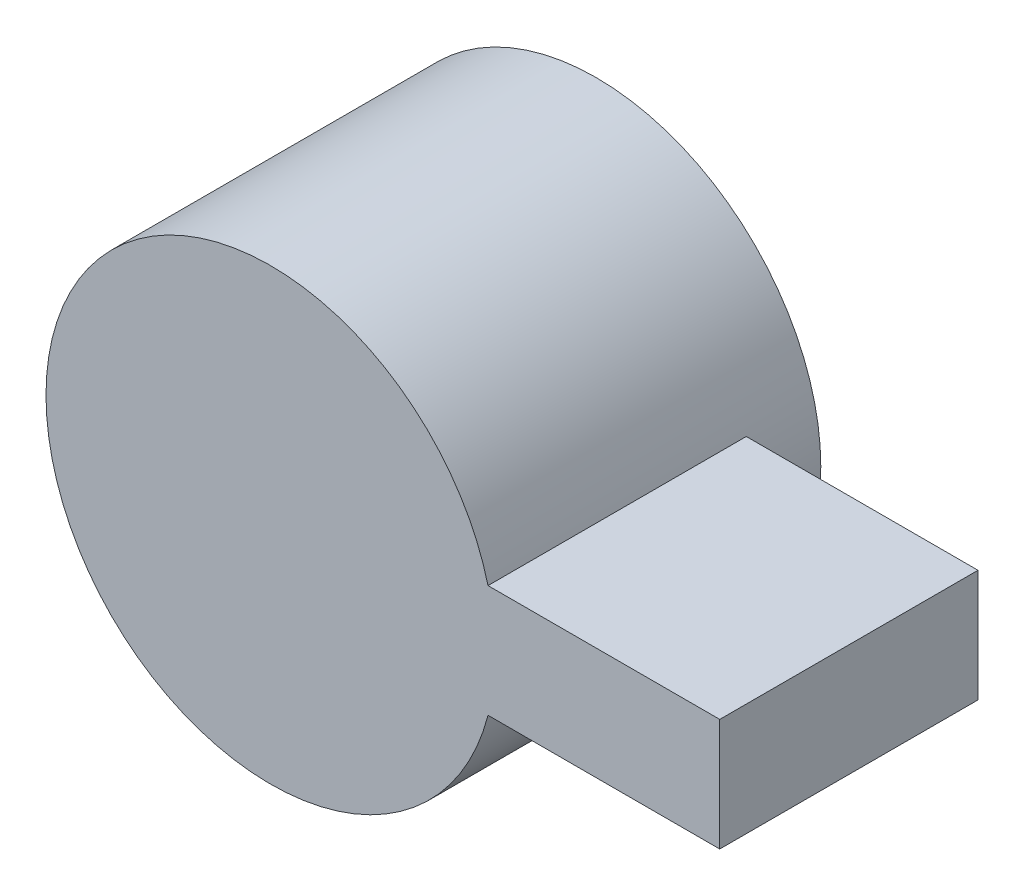
ISO-10303-21;
HEADER;
FILE_DESCRIPTION(('STEP AP214'),'2;1');
FILE_NAME('part.step','',(''),(''),'','','');
FILE_SCHEMA(('AUTOMOTIVE_DESIGN { 1 0 10303 214 1 1 1 1 }'));
ENDSEC;
DATA;
#1=APPLICATION_CONTEXT('core data for automotive mechanical design processes');
#2=APPLICATION_PROTOCOL_DEFINITION('international standard','automotive_design',2000,#1);
#3=PRODUCT_CONTEXT('',#1,'mechanical');
#4=PRODUCT('Part','Part','',(#3));
#5=PRODUCT_RELATED_PRODUCT_CATEGORY('part','',(#4));
#6=PRODUCT_DEFINITION_FORMATION('','',#4);
#7=PRODUCT_DEFINITION_CONTEXT('part definition',#1,'design');
#8=PRODUCT_DEFINITION('design','',#6,#7);
#9=PRODUCT_DEFINITION_SHAPE('','',#8);
#10=(LENGTH_UNIT() NAMED_UNIT(*) SI_UNIT(.MILLI.,.METRE.));
#11=(NAMED_UNIT(*) PLANE_ANGLE_UNIT() SI_UNIT($,.RADIAN.));
#12=(NAMED_UNIT(*) SI_UNIT($,.STERADIAN.) SOLID_ANGLE_UNIT());
#13=UNCERTAINTY_MEASURE_WITH_UNIT(LENGTH_MEASURE(1.E-05),#10,'distance_accuracy_value','');
#14=(GEOMETRIC_REPRESENTATION_CONTEXT(3) GLOBAL_UNCERTAINTY_ASSIGNED_CONTEXT((#13)) GLOBAL_UNIT_ASSIGNED_CONTEXT((#10,
#11,#12)) REPRESENTATION_CONTEXT('',''));
#15=CARTESIAN_POINT('',(0.,0.,0.));
#16=DIRECTION('',(0.,0.,1.));
#17=DIRECTION('',(1.,0.,0.));
#18=AXIS2_PLACEMENT_3D('',#15,#16,#17);
#19=CARTESIAN_POINT('',(0.,0.,0.));
#20=DIRECTION('',(0.,0.,1.));
#21=DIRECTION('',(1.,0.,0.));
#22=AXIS2_PLACEMENT_3D('',#19,#20,#21);
#23=PLANE('',#22);
#24=DIRECTION('',(0.,-1.,0.));
#25=VECTOR('',#24,1.);
#26=CARTESIAN_POINT('',(1.55,0.,0.));
#27=LINE('',#26,#25);
#28=CARTESIAN_POINT('',(1.55,2.62678510731274,0.));
#29=VERTEX_POINT('',#28);
#30=CARTESIAN_POINT('',(1.55,-2.62678510731274,0.));
#31=VERTEX_POINT('',#30);
#32=EDGE_CURVE('E102',#29,#31,#27,.T.);
#33=ORIENTED_EDGE('',*,*,#32,.F.);
#34=CARTESIAN_POINT('',(0.,0.,0.));
#35=DIRECTION('',(0.,0.,-1.));
#36=DIRECTION('',(-1.,0.,0.));
#37=AXIS2_PLACEMENT_3D('',#34,#35,#36);
#38=CIRCLE('',#37,3.05);
#39=EDGE_CURVE('E117',#29,#31,#38,.T.);
#40=ORIENTED_EDGE('',*,*,#39,.T.);
#41=EDGE_LOOP('',(#33,#40));
#42=FACE_BOUND('',#41,.T.);
#43=ADVANCED_FACE('F45',(#42),#23,.F.);
#44=CARTESIAN_POINT('',(0.,0.,10.));
#45=DIRECTION('',(0.,0.,-1.));
#46=DIRECTION('',(-1.,0.,0.));
#47=AXIS2_PLACEMENT_3D('',#44,#45,#46);
#48=CYLINDRICAL_SURFACE('',#47,3.05);
#49=DIRECTION('',(0.,0.,-1.));
#50=VECTOR('',#49,1.);
#51=CARTESIAN_POINT('',(1.55,-2.62678510731274,10.));
#52=LINE('',#51,#50);
#53=CARTESIAN_POINT('',(1.55,-2.62678510731274,10.));
#54=VERTEX_POINT('',#53);
#55=EDGE_CURVE('E105',#54,#31,#52,.T.);
#56=ORIENTED_EDGE('',*,*,#55,.T.);
#57=ORIENTED_EDGE('',*,*,#39,.F.);
#58=DIRECTION('',(0.,0.,-1.));
#59=VECTOR('',#58,1.);
#60=CARTESIAN_POINT('',(1.55,2.62678510731274,10.));
#61=LINE('',#60,#59);
#62=CARTESIAN_POINT('',(1.55,2.62678510731274,10.));
#63=VERTEX_POINT('',#62);
#64=EDGE_CURVE('E61',#63,#29,#61,.T.);
#65=ORIENTED_EDGE('',*,*,#64,.F.);
#66=CARTESIAN_POINT('',(0.,0.,10.));
#67=DIRECTION('',(0.,0.,1.));
#68=DIRECTION('',(1.,0.,0.));
#69=AXIS2_PLACEMENT_3D('',#66,#67,#68);
#70=CIRCLE('',#69,3.05);
#71=EDGE_CURVE('E111',#63,#54,#70,.T.);
#72=ORIENTED_EDGE('',*,*,#71,.T.);
#73=EDGE_LOOP('',(#56,#57,#65,#72));
#74=FACE_BOUND('',#73,.T.);
#75=CARTESIAN_POINT('',(0.,0.,-3.));
#76=DIRECTION('',(0.,0.,-1.));
#77=DIRECTION('',(-1.,0.,0.));
#78=AXIS2_PLACEMENT_3D('',#75,#76,#77);
#79=CIRCLE('',#78,3.05);
#80=CARTESIAN_POINT('',(-3.05,0.,-3.));
#81=VERTEX_POINT('',#80);
#82=EDGE_CURVE('E126',#81,#81,#79,.T.);
#83=ORIENTED_EDGE('',*,*,#82,.T.);
#84=EDGE_LOOP('',(#83));
#85=FACE_BOUND('',#84,.T.);
#86=ADVANCED_FACE('F115',(#74,#85),#48,.F.);
#87=CARTESIAN_POINT('',(1.55,0.,10.));
#88=DIRECTION('',(1.,0.,0.));
#89=DIRECTION('',(0.,0.,-1.));
#90=AXIS2_PLACEMENT_3D('',#87,#88,#89);
#91=PLANE('',#90);
#92=ORIENTED_EDGE('',*,*,#32,.T.);
#93=ORIENTED_EDGE('',*,*,#55,.F.);
#94=DIRECTION('',(0.,-1.,0.));
#95=VECTOR('',#94,1.);
#96=CARTESIAN_POINT('',(1.55,0.,10.));
#97=LINE('',#96,#95);
#98=EDGE_CURVE('E133',#63,#54,#97,.T.);
#99=ORIENTED_EDGE('',*,*,#98,.F.);
#100=ORIENTED_EDGE('',*,*,#64,.T.);
#101=EDGE_LOOP('',(#92,#93,#99,#100));
#102=FACE_BOUND('',#101,.T.);
#103=ADVANCED_FACE('F104',(#102),#91,.F.);
#104=CARTESIAN_POINT('',(0.,0.,10.));
#105=DIRECTION('',(0.,0.,1.));
#106=DIRECTION('',(1.,0.,0.));
#107=AXIS2_PLACEMENT_3D('',#104,#105,#106);
#108=PLANE('',#107);
#109=ORIENTED_EDGE('',*,*,#71,.F.);
#110=ORIENTED_EDGE('',*,*,#98,.T.);
#111=EDGE_LOOP('',(#109,#110));
#112=FACE_BOUND('',#111,.T.);
#113=ADVANCED_FACE('F234',(#112),#108,.F.);
#114=CARTESIAN_POINT('',(0.,0.,-3.));
#115=DIRECTION('',(0.,0.,-1.));
#116=DIRECTION('',(-1.,0.,0.));
#117=AXIS2_PLACEMENT_3D('',#114,#115,#116);
#118=PLANE('',#117);
#119=ORIENTED_EDGE('',*,*,#82,.F.);
#120=EDGE_LOOP('',(#119));
#121=FACE_BOUND('',#120,.T.);
#122=CARTESIAN_POINT('',(0.,0.,-3.));
#123=DIRECTION('',(0.,0.,-1.));
#124=DIRECTION('',(-1.,0.,0.));
#125=AXIS2_PLACEMENT_3D('',#122,#123,#124);
#126=CIRCLE('',#125,10.);
#127=CARTESIAN_POINT('',(-10.,0.,-3.));
#128=VERTEX_POINT('',#127);
#129=EDGE_CURVE('E112',#128,#128,#126,.T.);
#130=ORIENTED_EDGE('',*,*,#129,.T.);
#131=EDGE_LOOP('',(#130));
#132=FACE_BOUND('',#131,.T.);
#133=ADVANCED_FACE('F188',(#121,#132),#118,.T.);
#134=CARTESIAN_POINT('',(20.,0.,11.5));
#135=DIRECTION('',(1.,0.,0.));
#136=DIRECTION('',(0.,0.,-1.));
#137=AXIS2_PLACEMENT_3D('',#134,#135,#136);
#138=PLANE('',#137);
#139=DIRECTION('',(0.,-1.,0.));
#140=VECTOR('',#139,1.);
#141=CARTESIAN_POINT('',(20.,0.,0.));
#142=LINE('',#141,#140);
#143=CARTESIAN_POINT('',(20.,2.5,0.));
#144=VERTEX_POINT('',#143);
#145=CARTESIAN_POINT('',(20.,-2.5,0.));
#146=VERTEX_POINT('',#145);
#147=EDGE_CURVE('E142',#144,#146,#142,.T.);
#148=ORIENTED_EDGE('',*,*,#147,.F.);
#149=DIRECTION('',(0.,0.,-1.));
#150=VECTOR('',#149,1.);
#151=CARTESIAN_POINT('',(20.,2.5,11.5));
#152=LINE('',#151,#150);
#153=CARTESIAN_POINT('',(20.,2.5,11.5));
#154=VERTEX_POINT('',#153);
#155=EDGE_CURVE('E70',#154,#144,#152,.T.);
#156=ORIENTED_EDGE('',*,*,#155,.F.);
#157=DIRECTION('',(0.,-1.,0.));
#158=VECTOR('',#157,1.);
#159=CARTESIAN_POINT('',(20.,0.,11.5));
#160=LINE('',#159,#158);
#161=CARTESIAN_POINT('',(20.,-2.5,11.5));
#162=VERTEX_POINT('',#161);
#163=EDGE_CURVE('E149',#154,#162,#160,.T.);
#164=ORIENTED_EDGE('',*,*,#163,.T.);
#165=DIRECTION('',(0.,0.,-1.));
#166=VECTOR('',#165,1.);
#167=CARTESIAN_POINT('',(20.,-2.5,11.5));
#168=LINE('',#167,#166);
#169=EDGE_CURVE('E163',#162,#146,#168,.T.);
#170=ORIENTED_EDGE('',*,*,#169,.T.);
#171=EDGE_LOOP('',(#148,#156,#164,#170));
#172=FACE_BOUND('',#171,.T.);
#173=ADVANCED_FACE('F175',(#172),#138,.T.);
#174=CARTESIAN_POINT('',(0.,2.5,11.5));
#175=DIRECTION('',(0.,1.,0.));
#176=DIRECTION('',(0.,0.,1.));
#177=AXIS2_PLACEMENT_3D('',#174,#175,#176);
#178=PLANE('',#177);
#179=DIRECTION('',(1.,0.,0.));
#180=VECTOR('',#179,1.);
#181=CARTESIAN_POINT('',(0.,2.5,0.));
#182=LINE('',#181,#180);
#183=CARTESIAN_POINT('',(9.68245836551854,2.5,0.));
#184=VERTEX_POINT('',#183);
#185=EDGE_CURVE('E120',#184,#144,#182,.T.);
#186=ORIENTED_EDGE('',*,*,#185,.F.);
#187=DIRECTION('',(0.,0.,-1.));
#188=VECTOR('',#187,1.);
#189=CARTESIAN_POINT('',(9.68245836551854,2.5,11.5));
#190=LINE('',#189,#188);
#191=CARTESIAN_POINT('',(9.68245836551854,2.5,11.5));
#192=VERTEX_POINT('',#191);
#193=EDGE_CURVE('E11',#192,#184,#190,.T.);
#194=ORIENTED_EDGE('',*,*,#193,.F.);
#195=DIRECTION('',(1.,0.,0.));
#196=VECTOR('',#195,1.);
#197=CARTESIAN_POINT('',(0.,2.5,11.5));
#198=LINE('',#197,#196);
#199=EDGE_CURVE('E138',#192,#154,#198,.T.);
#200=ORIENTED_EDGE('',*,*,#199,.T.);
#201=ORIENTED_EDGE('',*,*,#155,.T.);
#202=EDGE_LOOP('',(#186,#194,#200,#201));
#203=FACE_BOUND('',#202,.T.);
#204=ADVANCED_FACE('F47',(#203),#178,.T.);
#205=CARTESIAN_POINT('',(0.,0.,11.5));
#206=DIRECTION('',(0.,0.,1.));
#207=DIRECTION('',(1.,0.,0.));
#208=AXIS2_PLACEMENT_3D('',#205,#206,#207);
#209=PLANE('',#208);
#210=ORIENTED_EDGE('',*,*,#199,.F.);
#211=CARTESIAN_POINT('',(0.,0.,11.5));
#212=DIRECTION('',(0.,0.,1.));
#213=DIRECTION('',(1.,0.,0.));
#214=AXIS2_PLACEMENT_3D('',#211,#212,#213);
#215=CIRCLE('',#214,10.);
#216=CARTESIAN_POINT('',(9.68245836551854,-2.5,11.5));
#217=VERTEX_POINT('',#216);
#218=EDGE_CURVE('E141',#192,#217,#215,.T.);
#219=ORIENTED_EDGE('',*,*,#218,.T.);
#220=DIRECTION('',(-1.,0.,0.));
#221=VECTOR('',#220,1.);
#222=CARTESIAN_POINT('',(0.,-2.5,11.5));
#223=LINE('',#222,#221);
#224=EDGE_CURVE('E145',#162,#217,#223,.T.);
#225=ORIENTED_EDGE('',*,*,#224,.F.);
#226=ORIENTED_EDGE('',*,*,#163,.F.);
#227=EDGE_LOOP('',(#210,#219,#225,#226));
#228=FACE_BOUND('',#227,.T.);
#229=ADVANCED_FACE('F179',(#228),#209,.T.);
#230=CARTESIAN_POINT('',(0.,0.,0.));
#231=DIRECTION('',(0.,0.,-1.));
#232=DIRECTION('',(-1.,0.,0.));
#233=AXIS2_PLACEMENT_3D('',#230,#231,#232);
#234=CIRCLE('',#233,10.);
#235=CARTESIAN_POINT('',(9.68245836551854,-2.5,0.));
#236=VERTEX_POINT('',#235);
#237=EDGE_CURVE('E123',#184,#236,#234,.T.);
#238=ORIENTED_EDGE('',*,*,#237,.F.);
#239=ORIENTED_EDGE('',*,*,#185,.T.);
#240=ORIENTED_EDGE('',*,*,#147,.T.);
#241=DIRECTION('',(-1.,0.,0.));
#242=VECTOR('',#241,1.);
#243=CARTESIAN_POINT('',(0.,-2.5,0.));
#244=LINE('',#243,#242);
#245=EDGE_CURVE('E154',#146,#236,#244,.T.);
#246=ORIENTED_EDGE('',*,*,#245,.T.);
#247=EDGE_LOOP('',(#238,#239,#240,#246));
#248=FACE_BOUND('',#247,.T.);
#249=ADVANCED_FACE('F174',(#248),#23,.F.);
#250=CARTESIAN_POINT('',(0.,-2.5,11.5));
#251=DIRECTION('',(0.,-1.,0.));
#252=DIRECTION('',(0.,0.,-1.));
#253=AXIS2_PLACEMENT_3D('',#250,#251,#252);
#254=PLANE('',#253);
#255=ORIENTED_EDGE('',*,*,#245,.F.);
#256=ORIENTED_EDGE('',*,*,#169,.F.);
#257=ORIENTED_EDGE('',*,*,#224,.T.);
#258=DIRECTION('',(0.,0.,-1.));
#259=VECTOR('',#258,1.);
#260=CARTESIAN_POINT('',(9.68245836551854,-2.5,11.5));
#261=LINE('',#260,#259);
#262=EDGE_CURVE('E54',#217,#236,#261,.T.);
#263=ORIENTED_EDGE('',*,*,#262,.T.);
#264=EDGE_LOOP('',(#255,#256,#257,#263));
#265=FACE_BOUND('',#264,.T.);
#266=ADVANCED_FACE('F170',(#265),#254,.T.);
#267=CARTESIAN_POINT('',(0.,0.,11.5));
#268=DIRECTION('',(0.,0.,-1.));
#269=DIRECTION('',(-1.,0.,0.));
#270=AXIS2_PLACEMENT_3D('',#267,#268,#269);
#271=CYLINDRICAL_SURFACE('',#270,10.);
#272=ORIENTED_EDGE('',*,*,#193,.T.);
#273=ORIENTED_EDGE('',*,*,#237,.T.);
#274=ORIENTED_EDGE('',*,*,#262,.F.);
#275=ORIENTED_EDGE('',*,*,#218,.F.);
#276=EDGE_LOOP('',(#272,#273,#274,#275));
#277=FACE_BOUND('',#276,.T.);
#278=ORIENTED_EDGE('',*,*,#129,.F.);
#279=EDGE_LOOP('',(#278));
#280=FACE_BOUND('',#279,.T.);
#281=ADVANCED_FACE('F180',(#277,#280),#271,.T.);
#282=CLOSED_SHELL('',(#43,#86,#103,#113,#133,#173,#204,#229,#249,#266,#281));
#283=MANIFOLD_SOLID_BREP('B2',#282);
#284=ADVANCED_BREP_SHAPE_REPRESENTATION('',(#18,#283),#14);
#285=SHAPE_DEFINITION_REPRESENTATION(#9,#284);
ENDSEC;
END-ISO-10303-21;
